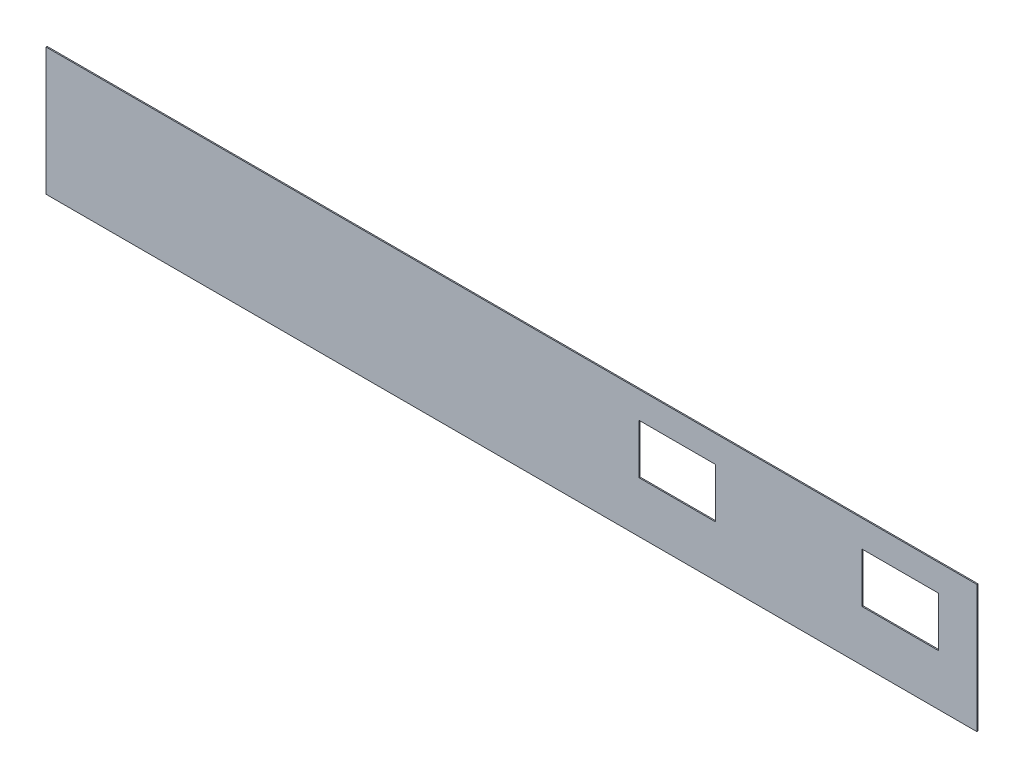
ISO-10303-21;
HEADER;
FILE_DESCRIPTION(('STEP AP214'),'2;1');
FILE_NAME('part.step','',(''),(''),'','','');
FILE_SCHEMA(('AUTOMOTIVE_DESIGN { 1 0 10303 214 1 1 1 1 }'));
ENDSEC;
DATA;
#1=APPLICATION_CONTEXT('core data for automotive mechanical design processes');
#2=APPLICATION_PROTOCOL_DEFINITION('international standard','automotive_design',2000,#1);
#3=PRODUCT_CONTEXT('',#1,'mechanical');
#4=PRODUCT('Part','Part','',(#3));
#5=PRODUCT_RELATED_PRODUCT_CATEGORY('part','',(#4));
#6=PRODUCT_DEFINITION_FORMATION('','',#4);
#7=PRODUCT_DEFINITION_CONTEXT('part definition',#1,'design');
#8=PRODUCT_DEFINITION('design','',#6,#7);
#9=PRODUCT_DEFINITION_SHAPE('','',#8);
#10=(LENGTH_UNIT() NAMED_UNIT(*) SI_UNIT(.MILLI.,.METRE.));
#11=(NAMED_UNIT(*) PLANE_ANGLE_UNIT() SI_UNIT($,.RADIAN.));
#12=(NAMED_UNIT(*) SI_UNIT($,.STERADIAN.) SOLID_ANGLE_UNIT());
#13=UNCERTAINTY_MEASURE_WITH_UNIT(LENGTH_MEASURE(1.E-05),#10,'distance_accuracy_value','');
#14=(GEOMETRIC_REPRESENTATION_CONTEXT(3) GLOBAL_UNCERTAINTY_ASSIGNED_CONTEXT((#13)) GLOBAL_UNIT_ASSIGNED_CONTEXT((#10,
#11,#12)) REPRESENTATION_CONTEXT('',''));
#15=CARTESIAN_POINT('',(0.,0.,0.));
#16=DIRECTION('',(0.,0.,1.));
#17=DIRECTION('',(1.,0.,0.));
#18=AXIS2_PLACEMENT_3D('',#15,#16,#17);
#19=CARTESIAN_POINT('',(0.,0.,0.09));
#20=DIRECTION('',(0.,0.,-1.));
#21=DIRECTION('',(-1.,0.,0.));
#22=AXIS2_PLACEMENT_3D('',#19,#20,#21);
#23=PLANE('',#22);
#24=DIRECTION('',(0.,-1.,0.));
#25=VECTOR('',#24,1.);
#26=CARTESIAN_POINT('',(87.,7.9,0.09));
#27=LINE('',#26,#25);
#28=CARTESIAN_POINT('',(87.,7.9,0.09));
#29=VERTEX_POINT('',#28);
#30=CARTESIAN_POINT('',(87.,4.,0.09));
#31=VERTEX_POINT('',#30);
#32=EDGE_CURVE('E160',#29,#31,#27,.T.);
#33=ORIENTED_EDGE('',*,*,#32,.F.);
#34=DIRECTION('',(-1.,0.,0.));
#35=VECTOR('',#34,1.);
#36=CARTESIAN_POINT('',(93.,7.9,0.09));
#37=LINE('',#36,#35);
#38=CARTESIAN_POINT('',(93.,7.9,0.09));
#39=VERTEX_POINT('',#38);
#40=EDGE_CURVE('E168',#39,#29,#37,.T.);
#41=ORIENTED_EDGE('',*,*,#40,.F.);
#42=DIRECTION('',(0.,1.,0.));
#43=VECTOR('',#42,1.);
#44=CARTESIAN_POINT('',(93.,4.,0.09));
#45=LINE('',#44,#43);
#46=CARTESIAN_POINT('',(93.,4.,0.09));
#47=VERTEX_POINT('',#46);
#48=EDGE_CURVE('E165',#47,#39,#45,.T.);
#49=ORIENTED_EDGE('',*,*,#48,.F.);
#50=DIRECTION('',(1.,0.,0.));
#51=VECTOR('',#50,1.);
#52=CARTESIAN_POINT('',(87.,4.,0.09));
#53=LINE('',#52,#51);
#54=EDGE_CURVE('E162',#31,#47,#53,.T.);
#55=ORIENTED_EDGE('',*,*,#54,.F.);
#56=EDGE_LOOP('',(#33,#41,#49,#55));
#57=FACE_BOUND('',#56,.T.);
#58=DIRECTION('',(0.,1.,0.));
#59=VECTOR('',#58,1.);
#60=CARTESIAN_POINT('',(96.,10.,0.09));
#61=LINE('',#60,#59);
#62=CARTESIAN_POINT('',(96.,0.,0.09));
#63=VERTEX_POINT('',#62);
#64=CARTESIAN_POINT('',(96.,10.,0.09));
#65=VERTEX_POINT('',#64);
#66=EDGE_CURVE('E191',#63,#65,#61,.T.);
#67=ORIENTED_EDGE('',*,*,#66,.T.);
#68=DIRECTION('',(-1.,0.,0.));
#69=VECTOR('',#68,1.);
#70=CARTESIAN_POINT('',(30.,10.,0.09));
#71=LINE('',#70,#69);
#72=CARTESIAN_POINT('',(23.,10.,0.09));
#73=VERTEX_POINT('',#72);
#74=EDGE_CURVE('E194',#65,#73,#71,.T.);
#75=ORIENTED_EDGE('',*,*,#74,.T.);
#76=DIRECTION('',(0.,-1.,0.));
#77=VECTOR('',#76,1.);
#78=CARTESIAN_POINT('',(23.,0.,0.09));
#79=LINE('',#78,#77);
#80=CARTESIAN_POINT('',(23.,0.,0.09));
#81=VERTEX_POINT('',#80);
#82=EDGE_CURVE('E197',#73,#81,#79,.T.);
#83=ORIENTED_EDGE('',*,*,#82,.T.);
#84=DIRECTION('',(1.,0.,0.));
#85=VECTOR('',#84,1.);
#86=CARTESIAN_POINT('',(30.,0.,0.09));
#87=LINE('',#86,#85);
#88=EDGE_CURVE('E199',#81,#63,#87,.T.);
#89=ORIENTED_EDGE('',*,*,#88,.T.);
#90=EDGE_LOOP('',(#67,#75,#83,#89));
#91=FACE_BOUND('',#90,.T.);
#92=DIRECTION('',(0.,-1.,0.));
#93=VECTOR('',#92,1.);
#94=CARTESIAN_POINT('',(69.5,7.9,0.09));
#95=LINE('',#94,#93);
#96=CARTESIAN_POINT('',(69.5,7.9,0.09));
#97=VERTEX_POINT('',#96);
#98=CARTESIAN_POINT('',(69.5,4.,0.09));
#99=VERTEX_POINT('',#98);
#100=EDGE_CURVE('E124',#97,#99,#95,.T.);
#101=ORIENTED_EDGE('',*,*,#100,.F.);
#102=DIRECTION('',(-1.,0.,0.));
#103=VECTOR('',#102,1.);
#104=CARTESIAN_POINT('',(75.5,7.9,0.09));
#105=LINE('',#104,#103);
#106=CARTESIAN_POINT('',(75.5,7.9,0.09));
#107=VERTEX_POINT('',#106);
#108=EDGE_CURVE('E146',#107,#97,#105,.T.);
#109=ORIENTED_EDGE('',*,*,#108,.F.);
#110=DIRECTION('',(0.,1.,0.));
#111=VECTOR('',#110,1.);
#112=CARTESIAN_POINT('',(75.5,4.,0.09));
#113=LINE('',#112,#111);
#114=CARTESIAN_POINT('',(75.5,4.,0.09));
#115=VERTEX_POINT('',#114);
#116=EDGE_CURVE('E144',#115,#107,#113,.T.);
#117=ORIENTED_EDGE('',*,*,#116,.F.);
#118=DIRECTION('',(1.,0.,0.));
#119=VECTOR('',#118,1.);
#120=CARTESIAN_POINT('',(69.5,4.,0.09));
#121=LINE('',#120,#119);
#122=EDGE_CURVE('E132',#99,#115,#121,.T.);
#123=ORIENTED_EDGE('',*,*,#122,.F.);
#124=EDGE_LOOP('',(#101,#109,#117,#123));
#125=FACE_BOUND('',#124,.T.);
#126=ADVANCED_FACE('F35',(#57,#91,#125),#23,.F.);
#127=CARTESIAN_POINT('',(0.,0.,0.));
#128=DIRECTION('',(0.,0.,-1.));
#129=DIRECTION('',(-1.,0.,0.));
#130=AXIS2_PLACEMENT_3D('',#127,#128,#129);
#131=PLANE('',#130);
#132=DIRECTION('',(0.,1.,0.));
#133=VECTOR('',#132,1.);
#134=CARTESIAN_POINT('',(96.,10.,0.));
#135=LINE('',#134,#133);
#136=CARTESIAN_POINT('',(96.,0.,0.));
#137=VERTEX_POINT('',#136);
#138=CARTESIAN_POINT('',(96.,10.,0.));
#139=VERTEX_POINT('',#138);
#140=EDGE_CURVE('E190',#137,#139,#135,.T.);
#141=ORIENTED_EDGE('',*,*,#140,.F.);
#142=DIRECTION('',(1.,0.,0.));
#143=VECTOR('',#142,1.);
#144=CARTESIAN_POINT('',(96.,0.,0.));
#145=LINE('',#144,#143);
#146=CARTESIAN_POINT('',(23.,0.,0.));
#147=VERTEX_POINT('',#146);
#148=EDGE_CURVE('E195',#147,#137,#145,.T.);
#149=ORIENTED_EDGE('',*,*,#148,.F.);
#150=DIRECTION('',(0.,-1.,0.));
#151=VECTOR('',#150,1.);
#152=CARTESIAN_POINT('',(23.,0.,0.));
#153=LINE('',#152,#151);
#154=CARTESIAN_POINT('',(23.,10.,0.));
#155=VERTEX_POINT('',#154);
#156=EDGE_CURVE('E206',#155,#147,#153,.T.);
#157=ORIENTED_EDGE('',*,*,#156,.F.);
#158=DIRECTION('',(-1.,0.,0.));
#159=VECTOR('',#158,1.);
#160=CARTESIAN_POINT('',(23.,10.,0.));
#161=LINE('',#160,#159);
#162=EDGE_CURVE('E204',#139,#155,#161,.T.);
#163=ORIENTED_EDGE('',*,*,#162,.F.);
#164=EDGE_LOOP('',(#141,#149,#157,#163));
#165=FACE_BOUND('',#164,.T.);
#166=DIRECTION('',(-1.,0.,0.));
#167=VECTOR('',#166,1.);
#168=CARTESIAN_POINT('',(93.,7.9,0.));
#169=LINE('',#168,#167);
#170=CARTESIAN_POINT('',(93.,7.9,0.));
#171=VERTEX_POINT('',#170);
#172=CARTESIAN_POINT('',(87.,7.9,0.));
#173=VERTEX_POINT('',#172);
#174=EDGE_CURVE('E163',#171,#173,#169,.T.);
#175=ORIENTED_EDGE('',*,*,#174,.T.);
#176=DIRECTION('',(0.,-1.,0.));
#177=VECTOR('',#176,1.);
#178=CARTESIAN_POINT('',(87.,7.9,0.));
#179=LINE('',#178,#177);
#180=CARTESIAN_POINT('',(87.,4.,0.));
#181=VERTEX_POINT('',#180);
#182=EDGE_CURVE('E140',#173,#181,#179,.T.);
#183=ORIENTED_EDGE('',*,*,#182,.T.);
#184=DIRECTION('',(1.,0.,0.));
#185=VECTOR('',#184,1.);
#186=CARTESIAN_POINT('',(87.,4.,0.));
#187=LINE('',#186,#185);
#188=CARTESIAN_POINT('',(93.,4.,0.));
#189=VERTEX_POINT('',#188);
#190=EDGE_CURVE('E173',#181,#189,#187,.T.);
#191=ORIENTED_EDGE('',*,*,#190,.T.);
#192=DIRECTION('',(0.,1.,0.));
#193=VECTOR('',#192,1.);
#194=CARTESIAN_POINT('',(93.,4.,0.));
#195=LINE('',#194,#193);
#196=EDGE_CURVE('E176',#189,#171,#195,.T.);
#197=ORIENTED_EDGE('',*,*,#196,.T.);
#198=EDGE_LOOP('',(#175,#183,#191,#197));
#199=FACE_BOUND('',#198,.T.);
#200=DIRECTION('',(-1.,0.,0.));
#201=VECTOR('',#200,1.);
#202=CARTESIAN_POINT('',(75.5,7.9,0.));
#203=LINE('',#202,#201);
#204=CARTESIAN_POINT('',(75.5,7.9,0.));
#205=VERTEX_POINT('',#204);
#206=CARTESIAN_POINT('',(69.5,7.9,0.));
#207=VERTEX_POINT('',#206);
#208=EDGE_CURVE('E133',#205,#207,#203,.T.);
#209=ORIENTED_EDGE('',*,*,#208,.T.);
#210=DIRECTION('',(0.,-1.,0.));
#211=VECTOR('',#210,1.);
#212=CARTESIAN_POINT('',(69.5,7.9,0.));
#213=LINE('',#212,#211);
#214=CARTESIAN_POINT('',(69.5,4.,0.));
#215=VERTEX_POINT('',#214);
#216=EDGE_CURVE('E58',#207,#215,#213,.T.);
#217=ORIENTED_EDGE('',*,*,#216,.T.);
#218=DIRECTION('',(1.,0.,0.));
#219=VECTOR('',#218,1.);
#220=CARTESIAN_POINT('',(69.5,4.,0.));
#221=LINE('',#220,#219);
#222=CARTESIAN_POINT('',(75.5,4.,0.));
#223=VERTEX_POINT('',#222);
#224=EDGE_CURVE('E139',#215,#223,#221,.T.);
#225=ORIENTED_EDGE('',*,*,#224,.T.);
#226=DIRECTION('',(0.,1.,0.));
#227=VECTOR('',#226,1.);
#228=CARTESIAN_POINT('',(75.5,4.,0.));
#229=LINE('',#228,#227);
#230=EDGE_CURVE('E152',#223,#205,#229,.T.);
#231=ORIENTED_EDGE('',*,*,#230,.T.);
#232=EDGE_LOOP('',(#209,#217,#225,#231));
#233=FACE_BOUND('',#232,.T.);
#234=ADVANCED_FACE('F224',(#165,#199,#233),#131,.T.);
#235=CARTESIAN_POINT('',(96.,10.,0.09));
#236=DIRECTION('',(-1.,0.,0.));
#237=DIRECTION('',(0.,0.,1.));
#238=AXIS2_PLACEMENT_3D('',#235,#236,#237);
#239=PLANE('',#238);
#240=ORIENTED_EDGE('',*,*,#140,.T.);
#241=DIRECTION('',(0.,0.,-1.));
#242=VECTOR('',#241,1.);
#243=CARTESIAN_POINT('',(96.,10.,0.09));
#244=LINE('',#243,#242);
#245=EDGE_CURVE('E11',#65,#139,#244,.T.);
#246=ORIENTED_EDGE('',*,*,#245,.F.);
#247=ORIENTED_EDGE('',*,*,#66,.F.);
#248=DIRECTION('',(0.,0.,-1.));
#249=VECTOR('',#248,1.);
#250=CARTESIAN_POINT('',(96.,0.,0.09));
#251=LINE('',#250,#249);
#252=EDGE_CURVE('E201',#63,#137,#251,.T.);
#253=ORIENTED_EDGE('',*,*,#252,.T.);
#254=EDGE_LOOP('',(#240,#246,#247,#253));
#255=FACE_BOUND('',#254,.T.);
#256=ADVANCED_FACE('F37',(#255),#239,.F.);
#257=CARTESIAN_POINT('',(23.,10.,0.09));
#258=DIRECTION('',(0.,-1.,0.));
#259=DIRECTION('',(0.,0.,-1.));
#260=AXIS2_PLACEMENT_3D('',#257,#258,#259);
#261=PLANE('',#260);
#262=ORIENTED_EDGE('',*,*,#162,.T.);
#263=DIRECTION('',(0.,0.,-1.));
#264=VECTOR('',#263,1.);
#265=CARTESIAN_POINT('',(23.,10.,0.09));
#266=LINE('',#265,#264);
#267=EDGE_CURVE('E43',#73,#155,#266,.T.);
#268=ORIENTED_EDGE('',*,*,#267,.F.);
#269=ORIENTED_EDGE('',*,*,#74,.F.);
#270=ORIENTED_EDGE('',*,*,#245,.T.);
#271=EDGE_LOOP('',(#262,#268,#269,#270));
#272=FACE_BOUND('',#271,.T.);
#273=ADVANCED_FACE('F234',(#272),#261,.F.);
#274=CARTESIAN_POINT('',(23.,0.,0.09));
#275=DIRECTION('',(1.,0.,0.));
#276=DIRECTION('',(0.,0.,-1.));
#277=AXIS2_PLACEMENT_3D('',#274,#275,#276);
#278=PLANE('',#277);
#279=ORIENTED_EDGE('',*,*,#156,.T.);
#280=DIRECTION('',(0.,0.,-1.));
#281=VECTOR('',#280,1.);
#282=CARTESIAN_POINT('',(23.,0.,0.09));
#283=LINE('',#282,#281);
#284=EDGE_CURVE('E212',#81,#147,#283,.T.);
#285=ORIENTED_EDGE('',*,*,#284,.F.);
#286=ORIENTED_EDGE('',*,*,#82,.F.);
#287=ORIENTED_EDGE('',*,*,#267,.T.);
#288=EDGE_LOOP('',(#279,#285,#286,#287));
#289=FACE_BOUND('',#288,.T.);
#290=ADVANCED_FACE('F219',(#289),#278,.F.);
#291=CARTESIAN_POINT('',(96.,0.,0.09));
#292=DIRECTION('',(0.,1.,0.));
#293=DIRECTION('',(0.,0.,1.));
#294=AXIS2_PLACEMENT_3D('',#291,#292,#293);
#295=PLANE('',#294);
#296=ORIENTED_EDGE('',*,*,#148,.T.);
#297=ORIENTED_EDGE('',*,*,#252,.F.);
#298=ORIENTED_EDGE('',*,*,#88,.F.);
#299=ORIENTED_EDGE('',*,*,#284,.T.);
#300=EDGE_LOOP('',(#296,#297,#298,#299));
#301=FACE_BOUND('',#300,.T.);
#302=ADVANCED_FACE('F228',(#301),#295,.F.);
#303=CARTESIAN_POINT('',(87.,7.9,0.09));
#304=DIRECTION('',(1.,0.,0.));
#305=DIRECTION('',(0.,0.,-1.));
#306=AXIS2_PLACEMENT_3D('',#303,#304,#305);
#307=PLANE('',#306);
#308=ORIENTED_EDGE('',*,*,#182,.F.);
#309=DIRECTION('',(0.,0.,-1.));
#310=VECTOR('',#309,1.);
#311=CARTESIAN_POINT('',(87.,7.9,0.09));
#312=LINE('',#311,#310);
#313=EDGE_CURVE('E170',#29,#173,#312,.T.);
#314=ORIENTED_EDGE('',*,*,#313,.F.);
#315=ORIENTED_EDGE('',*,*,#32,.T.);
#316=DIRECTION('',(0.,0.,-1.));
#317=VECTOR('',#316,1.);
#318=CARTESIAN_POINT('',(87.,4.,0.09));
#319=LINE('',#318,#317);
#320=EDGE_CURVE('E187',#31,#181,#319,.T.);
#321=ORIENTED_EDGE('',*,*,#320,.T.);
#322=EDGE_LOOP('',(#308,#314,#315,#321));
#323=FACE_BOUND('',#322,.T.);
#324=ADVANCED_FACE('F250',(#323),#307,.T.);
#325=CARTESIAN_POINT('',(87.,4.,0.09));
#326=DIRECTION('',(0.,1.,0.));
#327=DIRECTION('',(0.,0.,1.));
#328=AXIS2_PLACEMENT_3D('',#325,#326,#327);
#329=PLANE('',#328);
#330=ORIENTED_EDGE('',*,*,#190,.F.);
#331=ORIENTED_EDGE('',*,*,#320,.F.);
#332=ORIENTED_EDGE('',*,*,#54,.T.);
#333=DIRECTION('',(0.,0.,-1.));
#334=VECTOR('',#333,1.);
#335=CARTESIAN_POINT('',(93.,4.,0.09));
#336=LINE('',#335,#334);
#337=EDGE_CURVE('E185',#47,#189,#336,.T.);
#338=ORIENTED_EDGE('',*,*,#337,.T.);
#339=EDGE_LOOP('',(#330,#331,#332,#338));
#340=FACE_BOUND('',#339,.T.);
#341=ADVANCED_FACE('F257',(#340),#329,.T.);
#342=CARTESIAN_POINT('',(93.,4.,0.09));
#343=DIRECTION('',(-1.,0.,0.));
#344=DIRECTION('',(0.,0.,1.));
#345=AXIS2_PLACEMENT_3D('',#342,#343,#344);
#346=PLANE('',#345);
#347=ORIENTED_EDGE('',*,*,#196,.F.);
#348=ORIENTED_EDGE('',*,*,#337,.F.);
#349=ORIENTED_EDGE('',*,*,#48,.T.);
#350=DIRECTION('',(0.,0.,-1.));
#351=VECTOR('',#350,1.);
#352=CARTESIAN_POINT('',(93.,7.9,0.09));
#353=LINE('',#352,#351);
#354=EDGE_CURVE('E183',#39,#171,#353,.T.);
#355=ORIENTED_EDGE('',*,*,#354,.T.);
#356=EDGE_LOOP('',(#347,#348,#349,#355));
#357=FACE_BOUND('',#356,.T.);
#358=ADVANCED_FACE('F262',(#357),#346,.T.);
#359=CARTESIAN_POINT('',(93.,7.9,0.09));
#360=DIRECTION('',(0.,-1.,0.));
#361=DIRECTION('',(0.,0.,-1.));
#362=AXIS2_PLACEMENT_3D('',#359,#360,#361);
#363=PLANE('',#362);
#364=ORIENTED_EDGE('',*,*,#174,.F.);
#365=ORIENTED_EDGE('',*,*,#354,.F.);
#366=ORIENTED_EDGE('',*,*,#40,.T.);
#367=ORIENTED_EDGE('',*,*,#313,.T.);
#368=EDGE_LOOP('',(#364,#365,#366,#367));
#369=FACE_BOUND('',#368,.T.);
#370=ADVANCED_FACE('F268',(#369),#363,.T.);
#371=CARTESIAN_POINT('',(69.5,7.9,0.09));
#372=DIRECTION('',(1.,0.,0.));
#373=DIRECTION('',(0.,0.,-1.));
#374=AXIS2_PLACEMENT_3D('',#371,#372,#373);
#375=PLANE('',#374);
#376=ORIENTED_EDGE('',*,*,#216,.F.);
#377=DIRECTION('',(0.,0.,-1.));
#378=VECTOR('',#377,1.);
#379=CARTESIAN_POINT('',(69.5,7.9,0.09));
#380=LINE('',#379,#378);
#381=EDGE_CURVE('E128',#97,#207,#380,.T.);
#382=ORIENTED_EDGE('',*,*,#381,.F.);
#383=ORIENTED_EDGE('',*,*,#100,.T.);
#384=DIRECTION('',(0.,0.,-1.));
#385=VECTOR('',#384,1.);
#386=CARTESIAN_POINT('',(69.5,4.,0.09));
#387=LINE('',#386,#385);
#388=EDGE_CURVE('E127',#99,#215,#387,.T.);
#389=ORIENTED_EDGE('',*,*,#388,.T.);
#390=EDGE_LOOP('',(#376,#382,#383,#389));
#391=FACE_BOUND('',#390,.T.);
#392=ADVANCED_FACE('F126',(#391),#375,.T.);
#393=CARTESIAN_POINT('',(69.5,4.,0.09));
#394=DIRECTION('',(0.,1.,0.));
#395=DIRECTION('',(0.,0.,1.));
#396=AXIS2_PLACEMENT_3D('',#393,#394,#395);
#397=PLANE('',#396);
#398=ORIENTED_EDGE('',*,*,#224,.F.);
#399=ORIENTED_EDGE('',*,*,#388,.F.);
#400=ORIENTED_EDGE('',*,*,#122,.T.);
#401=DIRECTION('',(0.,0.,-1.));
#402=VECTOR('',#401,1.);
#403=CARTESIAN_POINT('',(75.5,4.,0.09));
#404=LINE('',#403,#402);
#405=EDGE_CURVE('E141',#115,#223,#404,.T.);
#406=ORIENTED_EDGE('',*,*,#405,.T.);
#407=EDGE_LOOP('',(#398,#399,#400,#406));
#408=FACE_BOUND('',#407,.T.);
#409=ADVANCED_FACE('F136',(#408),#397,.T.);
#410=CARTESIAN_POINT('',(75.5,4.,0.09));
#411=DIRECTION('',(-1.,0.,0.));
#412=DIRECTION('',(0.,0.,1.));
#413=AXIS2_PLACEMENT_3D('',#410,#411,#412);
#414=PLANE('',#413);
#415=ORIENTED_EDGE('',*,*,#230,.F.);
#416=ORIENTED_EDGE('',*,*,#405,.F.);
#417=ORIENTED_EDGE('',*,*,#116,.T.);
#418=DIRECTION('',(0.,0.,-1.));
#419=VECTOR('',#418,1.);
#420=CARTESIAN_POINT('',(75.5,7.9,0.09));
#421=LINE('',#420,#419);
#422=EDGE_CURVE('E50',#107,#205,#421,.T.);
#423=ORIENTED_EDGE('',*,*,#422,.T.);
#424=EDGE_LOOP('',(#415,#416,#417,#423));
#425=FACE_BOUND('',#424,.T.);
#426=ADVANCED_FACE('F287',(#425),#414,.T.);
#427=CARTESIAN_POINT('',(75.5,7.9,0.09));
#428=DIRECTION('',(0.,-1.,0.));
#429=DIRECTION('',(0.,0.,-1.));
#430=AXIS2_PLACEMENT_3D('',#427,#428,#429);
#431=PLANE('',#430);
#432=ORIENTED_EDGE('',*,*,#208,.F.);
#433=ORIENTED_EDGE('',*,*,#422,.F.);
#434=ORIENTED_EDGE('',*,*,#108,.T.);
#435=ORIENTED_EDGE('',*,*,#381,.T.);
#436=EDGE_LOOP('',(#432,#433,#434,#435));
#437=FACE_BOUND('',#436,.T.);
#438=ADVANCED_FACE('F290',(#437),#431,.T.);
#439=CLOSED_SHELL('',(#126,#234,#256,#273,#290,#302,#324,#341,#358,#370,#392,#409,#426,#438));
#440=MANIFOLD_SOLID_BREP('B2',#439);
#441=ADVANCED_BREP_SHAPE_REPRESENTATION('',(#18,#440),#14);
#442=SHAPE_DEFINITION_REPRESENTATION(#9,#441);
ENDSEC;
END-ISO-10303-21;
